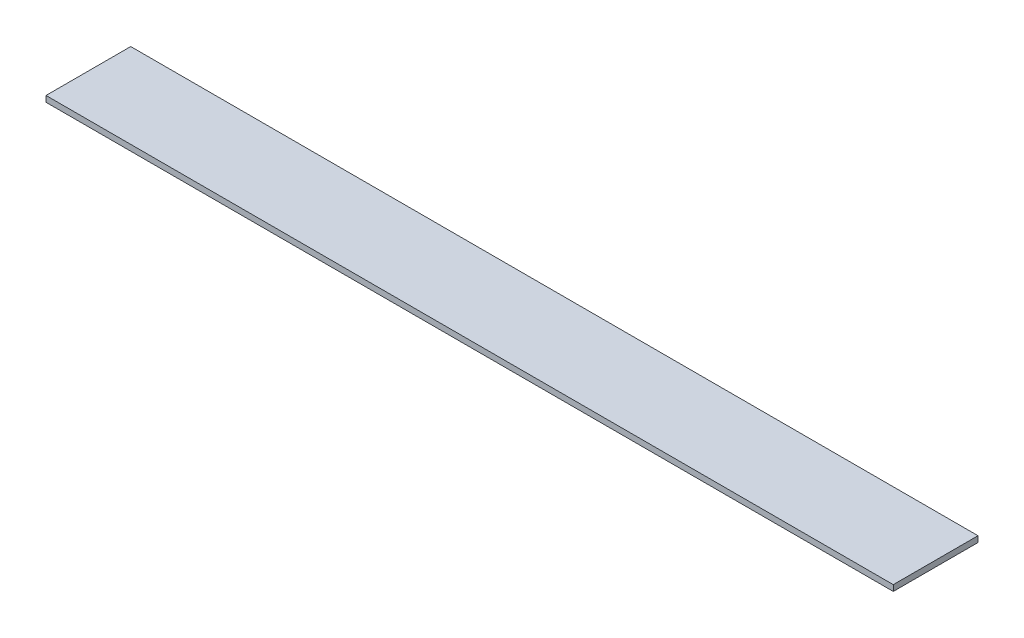
ISO-10303-21;
HEADER;
FILE_DESCRIPTION(('STEP AP214'),'2;1');
FILE_NAME('part.step','',(''),(''),'','','');
FILE_SCHEMA(('AUTOMOTIVE_DESIGN { 1 0 10303 214 1 1 1 1 }'));
ENDSEC;
DATA;
#1=APPLICATION_CONTEXT('core data for automotive mechanical design processes');
#2=APPLICATION_PROTOCOL_DEFINITION('international standard','automotive_design',2000,#1);
#3=PRODUCT_CONTEXT('',#1,'mechanical');
#4=PRODUCT('Part','Part','',(#3));
#5=PRODUCT_RELATED_PRODUCT_CATEGORY('part','',(#4));
#6=PRODUCT_DEFINITION_FORMATION('','',#4);
#7=PRODUCT_DEFINITION_CONTEXT('part definition',#1,'design');
#8=PRODUCT_DEFINITION('design','',#6,#7);
#9=PRODUCT_DEFINITION_SHAPE('','',#8);
#10=(LENGTH_UNIT() NAMED_UNIT(*) SI_UNIT(.MILLI.,.METRE.));
#11=(NAMED_UNIT(*) PLANE_ANGLE_UNIT() SI_UNIT($,.RADIAN.));
#12=(NAMED_UNIT(*) SI_UNIT($,.STERADIAN.) SOLID_ANGLE_UNIT());
#13=UNCERTAINTY_MEASURE_WITH_UNIT(LENGTH_MEASURE(1.E-05),#10,'distance_accuracy_value','');
#14=(GEOMETRIC_REPRESENTATION_CONTEXT(3) GLOBAL_UNCERTAINTY_ASSIGNED_CONTEXT((#13)) GLOBAL_UNIT_ASSIGNED_CONTEXT((#10,
#11,#12)) REPRESENTATION_CONTEXT('',''));
#15=CARTESIAN_POINT('',(0.,0.,0.));
#16=DIRECTION('',(0.,0.,1.));
#17=DIRECTION('',(1.,0.,0.));
#18=AXIS2_PLACEMENT_3D('',#15,#16,#17);
#19=CARTESIAN_POINT('',(50.,0.7,5.));
#20=DIRECTION('',(-1.,0.,0.));
#21=DIRECTION('',(0.,0.,1.));
#22=AXIS2_PLACEMENT_3D('',#19,#20,#21);
#23=PLANE('',#22);
#24=DIRECTION('',(0.,0.,-1.));
#25=VECTOR('',#24,1.);
#26=CARTESIAN_POINT('',(50.,0.,5.));
#27=LINE('',#26,#25);
#28=CARTESIAN_POINT('',(50.,0.,5.));
#29=VERTEX_POINT('',#28);
#30=CARTESIAN_POINT('',(50.,0.,-5.));
#31=VERTEX_POINT('',#30);
#32=EDGE_CURVE('E96',#29,#31,#27,.T.);
#33=ORIENTED_EDGE('',*,*,#32,.T.);
#34=DIRECTION('',(0.,-1.,0.));
#35=VECTOR('',#34,1.);
#36=CARTESIAN_POINT('',(50.,0.7,-5.));
#37=LINE('',#36,#35);
#38=CARTESIAN_POINT('',(50.,0.7,-5.));
#39=VERTEX_POINT('',#38);
#40=EDGE_CURVE('E11',#39,#31,#37,.T.);
#41=ORIENTED_EDGE('',*,*,#40,.F.);
#42=DIRECTION('',(0.,0.,-1.));
#43=VECTOR('',#42,1.);
#44=CARTESIAN_POINT('',(50.,0.7,5.));
#45=LINE('',#44,#43);
#46=CARTESIAN_POINT('',(50.,0.7,5.));
#47=VERTEX_POINT('',#46);
#48=EDGE_CURVE('E84',#47,#39,#45,.T.);
#49=ORIENTED_EDGE('',*,*,#48,.F.);
#50=DIRECTION('',(0.,-1.,0.));
#51=VECTOR('',#50,1.);
#52=CARTESIAN_POINT('',(50.,0.7,5.));
#53=LINE('',#52,#51);
#54=EDGE_CURVE('E92',#47,#29,#53,.T.);
#55=ORIENTED_EDGE('',*,*,#54,.T.);
#56=EDGE_LOOP('',(#33,#41,#49,#55));
#57=FACE_BOUND('',#56,.T.);
#58=ADVANCED_FACE('F33',(#57),#23,.F.);
#59=CARTESIAN_POINT('',(-50.,0.7,-5.));
#60=DIRECTION('',(0.,0.,1.));
#61=DIRECTION('',(1.,0.,0.));
#62=AXIS2_PLACEMENT_3D('',#59,#60,#61);
#63=PLANE('',#62);
#64=DIRECTION('',(-1.,0.,0.));
#65=VECTOR('',#64,1.);
#66=CARTESIAN_POINT('',(-50.,0.,-5.));
#67=LINE('',#66,#65);
#68=CARTESIAN_POINT('',(-50.,0.,-5.));
#69=VERTEX_POINT('',#68);
#70=EDGE_CURVE('E88',#31,#69,#67,.T.);
#71=ORIENTED_EDGE('',*,*,#70,.T.);
#72=DIRECTION('',(0.,-1.,0.));
#73=VECTOR('',#72,1.);
#74=CARTESIAN_POINT('',(-50.,0.7,-5.));
#75=LINE('',#74,#73);
#76=CARTESIAN_POINT('',(-50.,0.7,-5.));
#77=VERTEX_POINT('',#76);
#78=EDGE_CURVE('E41',#77,#69,#75,.T.);
#79=ORIENTED_EDGE('',*,*,#78,.F.);
#80=DIRECTION('',(-1.,0.,0.));
#81=VECTOR('',#80,1.);
#82=CARTESIAN_POINT('',(-50.,0.7,-5.));
#83=LINE('',#82,#81);
#84=EDGE_CURVE('E79',#39,#77,#83,.T.);
#85=ORIENTED_EDGE('',*,*,#84,.F.);
#86=ORIENTED_EDGE('',*,*,#40,.T.);
#87=EDGE_LOOP('',(#71,#79,#85,#86));
#88=FACE_BOUND('',#87,.T.);
#89=ADVANCED_FACE('F87',(#88),#63,.F.);
#90=CARTESIAN_POINT('',(-50.,0.7,5.));
#91=DIRECTION('',(1.,0.,0.));
#92=DIRECTION('',(0.,0.,-1.));
#93=AXIS2_PLACEMENT_3D('',#90,#91,#92);
#94=PLANE('',#93);
#95=DIRECTION('',(0.,0.,1.));
#96=VECTOR('',#95,1.);
#97=CARTESIAN_POINT('',(-50.,0.,5.));
#98=LINE('',#97,#96);
#99=CARTESIAN_POINT('',(-50.,0.,5.));
#100=VERTEX_POINT('',#99);
#101=EDGE_CURVE('E66',#69,#100,#98,.T.);
#102=ORIENTED_EDGE('',*,*,#101,.T.);
#103=DIRECTION('',(0.,-1.,0.));
#104=VECTOR('',#103,1.);
#105=CARTESIAN_POINT('',(-50.,0.7,5.));
#106=LINE('',#105,#104);
#107=CARTESIAN_POINT('',(-50.,0.7,5.));
#108=VERTEX_POINT('',#107);
#109=EDGE_CURVE('E89',#108,#100,#106,.T.);
#110=ORIENTED_EDGE('',*,*,#109,.F.);
#111=DIRECTION('',(0.,0.,1.));
#112=VECTOR('',#111,1.);
#113=CARTESIAN_POINT('',(-50.,0.7,5.));
#114=LINE('',#113,#112);
#115=EDGE_CURVE('E82',#77,#108,#114,.T.);
#116=ORIENTED_EDGE('',*,*,#115,.F.);
#117=ORIENTED_EDGE('',*,*,#78,.T.);
#118=EDGE_LOOP('',(#102,#110,#116,#117));
#119=FACE_BOUND('',#118,.T.);
#120=ADVANCED_FACE('F90',(#119),#94,.F.);
#121=CARTESIAN_POINT('',(-50.,0.7,5.));
#122=DIRECTION('',(0.,0.,-1.));
#123=DIRECTION('',(-1.,0.,0.));
#124=AXIS2_PLACEMENT_3D('',#121,#122,#123);
#125=PLANE('',#124);
#126=DIRECTION('',(1.,0.,0.));
#127=VECTOR('',#126,1.);
#128=CARTESIAN_POINT('',(-50.,0.,5.));
#129=LINE('',#128,#127);
#130=EDGE_CURVE('E72',#100,#29,#129,.T.);
#131=ORIENTED_EDGE('',*,*,#130,.T.);
#132=ORIENTED_EDGE('',*,*,#54,.F.);
#133=DIRECTION('',(1.,0.,0.));
#134=VECTOR('',#133,1.);
#135=CARTESIAN_POINT('',(-50.,0.7,5.));
#136=LINE('',#135,#134);
#137=EDGE_CURVE('E49',#108,#47,#136,.T.);
#138=ORIENTED_EDGE('',*,*,#137,.F.);
#139=ORIENTED_EDGE('',*,*,#109,.T.);
#140=EDGE_LOOP('',(#131,#132,#138,#139));
#141=FACE_BOUND('',#140,.T.);
#142=ADVANCED_FACE('F103',(#141),#125,.F.);
#143=CARTESIAN_POINT('',(0.,0.7,0.));
#144=DIRECTION('',(0.,-1.,0.));
#145=DIRECTION('',(0.,0.,-1.));
#146=AXIS2_PLACEMENT_3D('',#143,#144,#145);
#147=PLANE('',#146);
#148=ORIENTED_EDGE('',*,*,#48,.T.);
#149=ORIENTED_EDGE('',*,*,#84,.T.);
#150=ORIENTED_EDGE('',*,*,#115,.T.);
#151=ORIENTED_EDGE('',*,*,#137,.T.);
#152=EDGE_LOOP('',(#148,#149,#150,#151));
#153=FACE_BOUND('',#152,.T.);
#154=ADVANCED_FACE('F80',(#153),#147,.F.);
#155=CARTESIAN_POINT('',(0.,0.,0.));
#156=DIRECTION('',(0.,-1.,0.));
#157=DIRECTION('',(0.,0.,-1.));
#158=AXIS2_PLACEMENT_3D('',#155,#156,#157);
#159=PLANE('',#158);
#160=ORIENTED_EDGE('',*,*,#32,.F.);
#161=ORIENTED_EDGE('',*,*,#130,.F.);
#162=ORIENTED_EDGE('',*,*,#101,.F.);
#163=ORIENTED_EDGE('',*,*,#70,.F.);
#164=EDGE_LOOP('',(#160,#161,#162,#163));
#165=FACE_BOUND('',#164,.T.);
#166=ADVANCED_FACE('F106',(#165),#159,.T.);
#167=CLOSED_SHELL('',(#58,#89,#120,#142,#154,#166));
#168=MANIFOLD_SOLID_BREP('B2',#167);
#169=ADVANCED_BREP_SHAPE_REPRESENTATION('',(#18,#168),#14);
#170=SHAPE_DEFINITION_REPRESENTATION(#9,#169);
ENDSEC;
END-ISO-10303-21;
